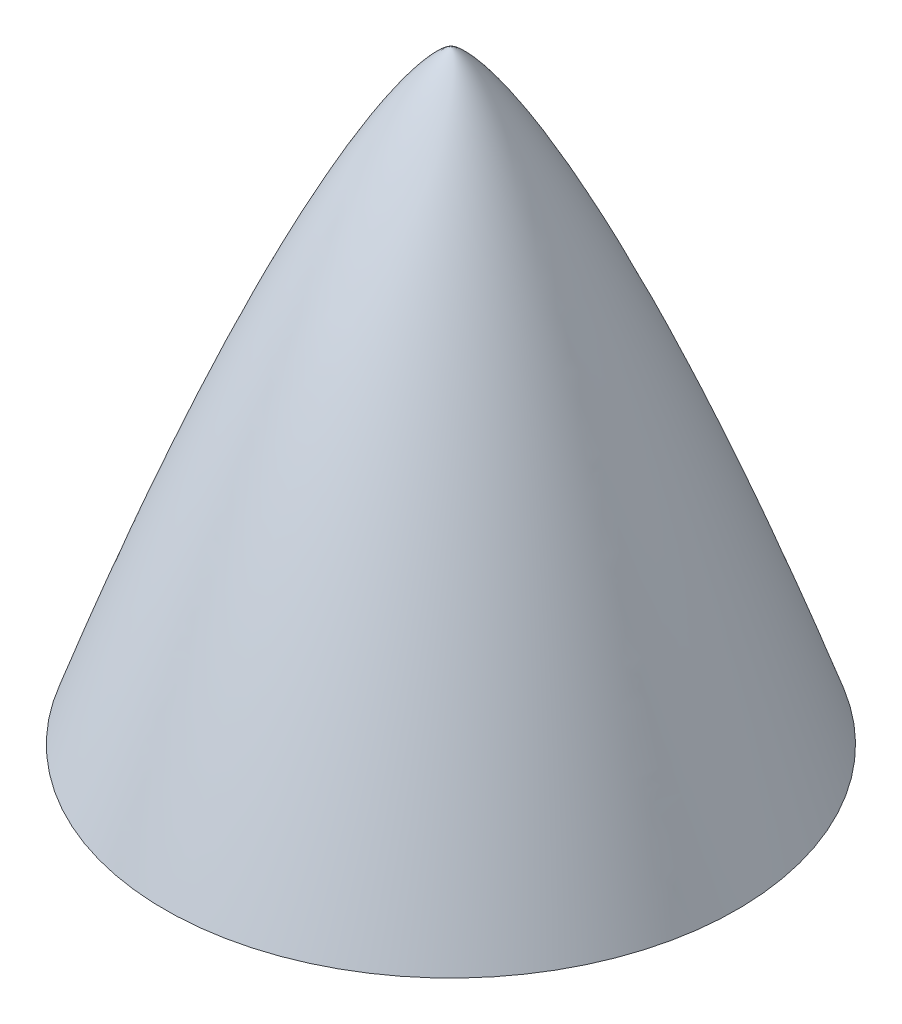
ISO-10303-21;
HEADER;
FILE_DESCRIPTION(('STEP AP214'),'2;1');
FILE_NAME('part.step','',(''),(''),'','','');
FILE_SCHEMA(('AUTOMOTIVE_DESIGN { 1 0 10303 214 1 1 1 1 }'));
ENDSEC;
DATA;
#1=APPLICATION_CONTEXT('core data for automotive mechanical design processes');
#2=APPLICATION_PROTOCOL_DEFINITION('international standard','automotive_design',2000,#1);
#3=PRODUCT_CONTEXT('',#1,'mechanical');
#4=PRODUCT('Part','Part','',(#3));
#5=PRODUCT_RELATED_PRODUCT_CATEGORY('part','',(#4));
#6=PRODUCT_DEFINITION_FORMATION('','',#4);
#7=PRODUCT_DEFINITION_CONTEXT('part definition',#1,'design');
#8=PRODUCT_DEFINITION('design','',#6,#7);
#9=PRODUCT_DEFINITION_SHAPE('','',#8);
#10=(LENGTH_UNIT() NAMED_UNIT(*) SI_UNIT(.MILLI.,.METRE.));
#11=(NAMED_UNIT(*) PLANE_ANGLE_UNIT() SI_UNIT($,.RADIAN.));
#12=(NAMED_UNIT(*) SI_UNIT($,.STERADIAN.) SOLID_ANGLE_UNIT());
#13=UNCERTAINTY_MEASURE_WITH_UNIT(LENGTH_MEASURE(1.E-05),#10,'distance_accuracy_value','');
#14=(GEOMETRIC_REPRESENTATION_CONTEXT(3) GLOBAL_UNCERTAINTY_ASSIGNED_CONTEXT((#13)) GLOBAL_UNIT_ASSIGNED_CONTEXT((#10,
#11,#12)) REPRESENTATION_CONTEXT('',''));
#15=CARTESIAN_POINT('',(0.,0.,0.));
#16=DIRECTION('',(0.,0.,1.));
#17=DIRECTION('',(1.,0.,0.));
#18=AXIS2_PLACEMENT_3D('',#15,#16,#17);
#19=CARTESIAN_POINT('',(0.,150.,0.));
#20=DIRECTION('',(0.,-1.,0.));
#21=DIRECTION('',(0.,0.,-1.));
#22=AXIS2_PLACEMENT_3D('',#19,#20,#21);
#23=PLANE('',#22);
#24=CARTESIAN_POINT('',(0.,150.,1.41703909797913));
#25=DIRECTION('',(0.,-1.,0.));
#26=DIRECTION('',(0.,0.,-1.));
#27=AXIS2_PLACEMENT_3D('',#24,#25,#26);
#28=CIRCLE('',#27,4.);
#29=CARTESIAN_POINT('',(0.,150.,-2.58296090202087));
#30=VERTEX_POINT('',#29);
#31=EDGE_CURVE('E61',#30,#30,#28,.T.);
#32=ORIENTED_EDGE('',*,*,#31,.F.);
#33=EDGE_LOOP('',(#32));
#34=FACE_BOUND('',#33,.T.);
#35=CARTESIAN_POINT('',(0.,150.,1.41703909797913));
#36=DIRECTION('',(0.,-1.,0.));
#37=DIRECTION('',(0.,0.,-1.));
#38=AXIS2_PLACEMENT_3D('',#35,#36,#37);
#39=CIRCLE('',#38,11.8408826921365);
#40=CARTESIAN_POINT('',(0.,150.,-10.4238435941574));
#41=VERTEX_POINT('',#40);
#42=EDGE_CURVE('E49',#41,#41,#39,.T.);
#43=ORIENTED_EDGE('',*,*,#42,.T.);
#44=EDGE_LOOP('',(#43));
#45=FACE_BOUND('',#44,.T.);
#46=ADVANCED_FACE('F43',(#34,#45),#23,.T.);
#47=CARTESIAN_POINT('',(0.,175.,1.41703909797882));
#48=CARTESIAN_POINT('',(0.,174.996926110935,1.40230870385453));
#49=CARTESIAN_POINT('',(0.,174.988044997103,1.37369144368384));
#50=CARTESIAN_POINT('',(0.,174.959776015095,1.31647765874029));
#51=CARTESIAN_POINT('',(0.,174.910188029353,1.23596951565129));
#52=CARTESIAN_POINT('',(0.,174.832731565981,1.13032036097419));
#53=CARTESIAN_POINT('',(0.,174.705027543845,0.979022729036701));
#54=CARTESIAN_POINT('',(0.,174.498472410917,0.764823609611645));
#55=CARTESIAN_POINT('',(0.,174.135605379571,0.435693655025172));
#56=CARTESIAN_POINT('',(0.,173.499743576817,-0.0663110733239804));
#57=CARTESIAN_POINT('',(0.,172.397511355964,-0.823195229242885));
#58=CARTESIAN_POINT('',(0.,170.49415768782,-1.95807081777693));
#59=CARTESIAN_POINT('',(0.,167.466475500052,-3.52618143110865));
#60=CARTESIAN_POINT('',(0.,162.358561863616,-5.84170644081218));
#61=CARTESIAN_POINT('',(0.,155.067877747912,-8.7072617782504));
#62=CARTESIAN_POINT('',(0.,145.945050115339,-11.867015167809));
#63=CARTESIAN_POINT('',(0.,135.368845489868,-15.1383068763673));
#64=CARTESIAN_POINT('',(0.,124.457761205261,-18.2043078397206));
#65=CARTESIAN_POINT('',(0.,113.483375088638,-21.0346508969955));
#66=CARTESIAN_POINT('',(0.,102.458088430257,-23.6588259824931));
#67=CARTESIAN_POINT('',(0.,91.3896234171181,-26.0942533260003));
#68=CARTESIAN_POINT('',(0.,80.2834793266302,-28.351289380638));
#69=CARTESIAN_POINT('',(0.,69.1433676958134,-30.4342482394559));
#70=CARTESIAN_POINT('',(0.,57.9720002828688,-32.3425136911602));
#71=CARTESIAN_POINT('',(0.,48.1712886387751,-33.8540020081131));
#72=CARTESIAN_POINT('',(0.,39.7530195149123,-35.0285223117887));
#73=CARTESIAN_POINT('',(0.,32.7261973062074,-35.9193075059558));
#74=CARTESIAN_POINT('',(0.,27.0978214374952,-36.5751495380881));
#75=CARTESIAN_POINT('',(0.,21.4625224477605,-37.1687696075303));
#76=CARTESIAN_POINT('',(0.,16.5255403593283,-37.6269760155221));
#77=CARTESIAN_POINT('',(0.,12.2894274331589,-37.9685723725014));
#78=CARTESIAN_POINT('',(0.,9.00477072353591,-38.1956993108102));
#79=CARTESIAN_POINT('',(0.,6.6738327661678,-38.3361134205941));
#80=CARTESIAN_POINT('',(0.,4.5904229928655,-38.4432465810786));
#81=CARTESIAN_POINT('',(0.,2.98435773140254,-38.5105628219298));
#82=CARTESIAN_POINT('',(0.,1.60723335659234,-38.5563535461158));
#83=CARTESIAN_POINT('',(0.,0.688882144122478,-38.5751397754171));
#84=CARTESIAN_POINT('',(0.,0.229638675762295,-38.5829609020214));
#85=CARTESIAN_POINT('',(0.,-1.51683262136344E-12,-38.5829609020213));
#86=B_SPLINE_CURVE_WITH_KNOTS('',4,(#47,#48,#49,#50,#51,#52,#53,#54,#55,#56,#57,#58,#59,#60,#61,
#62,#63,#64,#65,#66,#67,#68,#69,#70,#71,#72,#73,#74,#75,#76,#77,#78,#79,#80,#81,#82,#83,#84,
#85),.UNSPECIFIED.,.F.,.F.,(5,1,1,1,1,1,1,1,1,1,1,1,1,1,1,1,1,1,1,1,1,1,1,1,1,1,1,1,1,1,1,1,1,1,
1,5),(0.,0.000331821764534342,0.000663643529068684,0.00140286342766742,0.00209113168892687,
0.00322405159137342,0.00503906350268483,0.00797669686176629,0.01291469108686,0.021122569124992,
0.0345807462234924,0.0569409868761261,0.0882609154067486,0.145067788011467,0.207707597190141,
0.270347061056437,0.332986772672104,0.395626362274226,0.458265960825724,0.520905576770951,
0.583545178581141,0.646184758678018,0.708824408482266,0.77146405855864,0.802783880469164,
0.834103702379688,0.865423499143115,0.896743295906542,0.928063030096961,0.94372289719217,
0.959382764287379,0.969537073215534,0.97969138214369,0.989845691071845,0.994922845535922,1.),.UNSPECIFIED.);
#87=CARTESIAN_POINT('',(0.,0.,1.41703909797913));
#88=DIRECTION('',(0.,-1.,0.));
#89=AXIS1_PLACEMENT('',#87,#88);
#90=SURFACE_OF_REVOLUTION('',#86,#89);
#91=CARTESIAN_POINT('',(0.,175.,1.41703909797913));
#92=VERTEX_POINT('',#91);
#93=VERTEX_LOOP('',#92);
#94=FACE_BOUND('',#93,.T.);
#95=ORIENTED_EDGE('',*,*,#42,.F.);
#96=EDGE_LOOP('',(#95));
#97=FACE_BOUND('',#96,.T.);
#98=ADVANCED_FACE('F44',(#94,#97),#90,.T.);
#99=CARTESIAN_POINT('',(0.,145.,1.41703909797913));
#100=DIRECTION('',(0.,-1.,0.));
#101=DIRECTION('',(0.,0.,-1.));
#102=AXIS2_PLACEMENT_3D('',#99,#100,#101);
#103=PLANE('',#102);
#104=CARTESIAN_POINT('',(0.,145.,1.41703909797913));
#105=DIRECTION('',(0.,-1.,0.));
#106=DIRECTION('',(0.,0.,-1.));
#107=AXIS2_PLACEMENT_3D('',#104,#105,#106);
#108=CIRCLE('',#107,4.);
#109=CARTESIAN_POINT('',(0.,145.,-2.58296090202087));
#110=VERTEX_POINT('',#109);
#111=EDGE_CURVE('E56',#110,#110,#108,.T.);
#112=ORIENTED_EDGE('',*,*,#111,.T.);
#113=EDGE_LOOP('',(#112));
#114=FACE_BOUND('',#113,.T.);
#115=CARTESIAN_POINT('',(0.,145.,1.41703909797913));
#116=DIRECTION('',(0.,-1.,0.));
#117=DIRECTION('',(0.,0.,-1.));
#118=AXIS2_PLACEMENT_3D('',#115,#116,#117);
#119=CIRCLE('',#118,1.5);
#120=CARTESIAN_POINT('',(0.,145.,-0.0829609020208653));
#121=VERTEX_POINT('',#120);
#122=EDGE_CURVE('E75',#121,#121,#119,.T.);
#123=ORIENTED_EDGE('',*,*,#122,.F.);
#124=EDGE_LOOP('',(#123));
#125=FACE_BOUND('',#124,.T.);
#126=ADVANCED_FACE('F54',(#114,#125),#103,.T.);
#127=CARTESIAN_POINT('',(0.,145.,1.41703909797913));
#128=DIRECTION('',(0.,1.,0.));
#129=DIRECTION('',(0.,0.,1.));
#130=AXIS2_PLACEMENT_3D('',#127,#128,#129);
#131=CYLINDRICAL_SURFACE('',#130,4.);
#132=ORIENTED_EDGE('',*,*,#111,.F.);
#133=EDGE_LOOP('',(#132));
#134=FACE_BOUND('',#133,.T.);
#135=ORIENTED_EDGE('',*,*,#31,.T.);
#136=EDGE_LOOP('',(#135));
#137=FACE_BOUND('',#136,.T.);
#138=ADVANCED_FACE('F81',(#134,#137),#131,.T.);
#139=CARTESIAN_POINT('',(0.,145.,1.41703909797913));
#140=DIRECTION('',(0.,1.,0.));
#141=DIRECTION('',(0.,0.,1.));
#142=AXIS2_PLACEMENT_3D('',#139,#140,#141);
#143=CYLINDRICAL_SURFACE('',#142,1.5);
#144=ORIENTED_EDGE('',*,*,#122,.T.);
#145=EDGE_LOOP('',(#144));
#146=FACE_BOUND('',#145,.T.);
#147=CARTESIAN_POINT('',(0.,150.,1.41703909797913));
#148=DIRECTION('',(0.,-1.,0.));
#149=DIRECTION('',(0.,0.,-1.));
#150=AXIS2_PLACEMENT_3D('',#147,#148,#149);
#151=CIRCLE('',#150,1.5);
#152=CARTESIAN_POINT('',(0.,150.,-0.0829609020208653));
#153=VERTEX_POINT('',#152);
#154=EDGE_CURVE('E11',#153,#153,#151,.F.);
#155=ORIENTED_EDGE('',*,*,#154,.T.);
#156=EDGE_LOOP('',(#155));
#157=FACE_BOUND('',#156,.T.);
#158=ADVANCED_FACE('F76',(#146,#157),#143,.F.);
#159=ORIENTED_EDGE('',*,*,#154,.F.);
#160=EDGE_LOOP('',(#159));
#161=FACE_BOUND('',#160,.T.);
#162=ADVANCED_FACE('F95',(#161),#23,.T.);
#163=CLOSED_SHELL('',(#46,#98,#126,#138,#158,#162));
#164=MANIFOLD_SOLID_BREP('B2',#163);
#165=ADVANCED_BREP_SHAPE_REPRESENTATION('',(#18,#164),#14);
#166=SHAPE_DEFINITION_REPRESENTATION(#9,#165);
ENDSEC;
END-ISO-10303-21;
